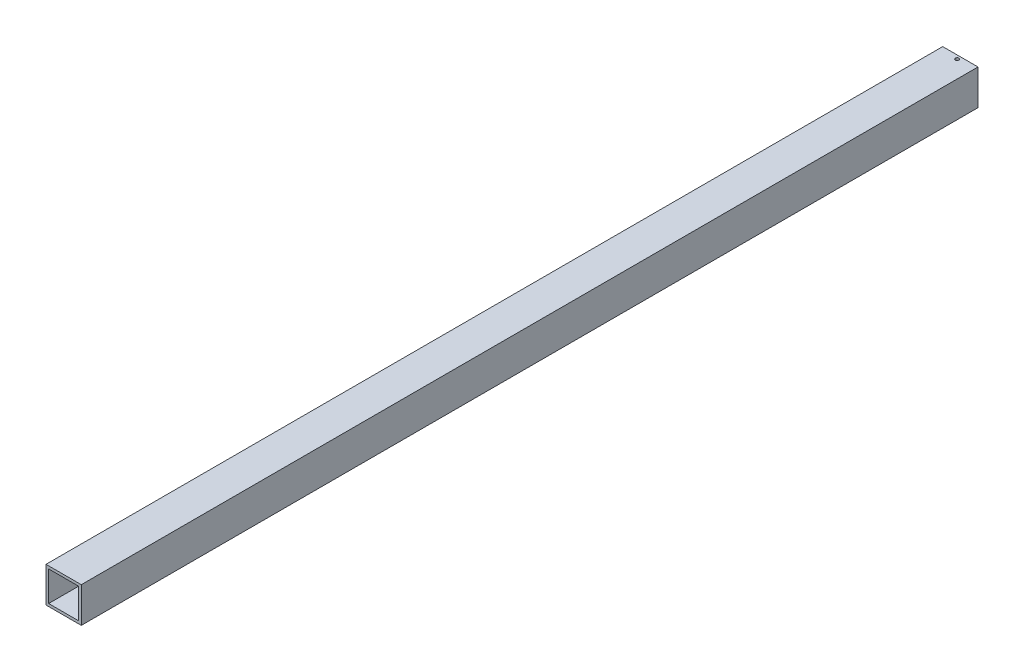
ISO-10303-21;
HEADER;
FILE_DESCRIPTION(('STEP AP214'),'2;1');
FILE_NAME('part.step','',(''),(''),'','','');
FILE_SCHEMA(('AUTOMOTIVE_DESIGN { 1 0 10303 214 1 1 1 1 }'));
ENDSEC;
DATA;
#1=APPLICATION_CONTEXT('core data for automotive mechanical design processes');
#2=APPLICATION_PROTOCOL_DEFINITION('international standard','automotive_design',2000,#1);
#3=PRODUCT_CONTEXT('',#1,'mechanical');
#4=PRODUCT('Part','Part','',(#3));
#5=PRODUCT_RELATED_PRODUCT_CATEGORY('part','',(#4));
#6=PRODUCT_DEFINITION_FORMATION('','',#4);
#7=PRODUCT_DEFINITION_CONTEXT('part definition',#1,'design');
#8=PRODUCT_DEFINITION('design','',#6,#7);
#9=PRODUCT_DEFINITION_SHAPE('','',#8);
#10=(LENGTH_UNIT() NAMED_UNIT(*) SI_UNIT(.MILLI.,.METRE.));
#11=(NAMED_UNIT(*) PLANE_ANGLE_UNIT() SI_UNIT($,.RADIAN.));
#12=(NAMED_UNIT(*) SI_UNIT($,.STERADIAN.) SOLID_ANGLE_UNIT());
#13=UNCERTAINTY_MEASURE_WITH_UNIT(LENGTH_MEASURE(1.E-05),#10,'distance_accuracy_value','');
#14=(GEOMETRIC_REPRESENTATION_CONTEXT(3) GLOBAL_UNCERTAINTY_ASSIGNED_CONTEXT((#13)) GLOBAL_UNIT_ASSIGNED_CONTEXT((#10,
#11,#12)) REPRESENTATION_CONTEXT('',''));
#15=CARTESIAN_POINT('',(0.,0.,0.));
#16=DIRECTION('',(0.,0.,1.));
#17=DIRECTION('',(1.,0.,0.));
#18=AXIS2_PLACEMENT_3D('',#15,#16,#17);
#19=CARTESIAN_POINT('',(-10.422988866238,18.5,536.599637723644));
#20=DIRECTION('',(-1.,0.,0.));
#21=DIRECTION('',(0.,-1.,0.));
#22=AXIS2_PLACEMENT_3D('',#19,#20,#21);
#23=PLANE('',#22);
#24=DIRECTION('',(0.,1.,0.));
#25=VECTOR('',#24,1.);
#26=CARTESIAN_POINT('',(-10.422988866238,18.5,508.315366476183));
#27=LINE('',#26,#25);
#28=CARTESIAN_POINT('',(-10.422988866238,-1.5,508.315366476183));
#29=VERTEX_POINT('',#28);
#30=CARTESIAN_POINT('',(-10.4229888662381,18.5000000000006,508.315366476183));
#31=VERTEX_POINT('',#30);
#32=EDGE_CURVE('E11',#29,#31,#27,.T.);
#33=ORIENTED_EDGE('',*,*,#32,.F.);
#34=DIRECTION('',(0.,0.,-1.));
#35=VECTOR('',#34,1.);
#36=CARTESIAN_POINT('',(-10.422988866238,-1.5,536.599637723644));
#37=LINE('',#36,#35);
#38=CARTESIAN_POINT('',(-10.422988866238,-1.5,0.));
#39=VERTEX_POINT('',#38);
#40=EDGE_CURVE('E151',#29,#39,#37,.T.);
#41=ORIENTED_EDGE('',*,*,#40,.T.);
#42=DIRECTION('',(0.,1.,0.));
#43=VECTOR('',#42,1.);
#44=CARTESIAN_POINT('',(-10.422988866238,18.5,0.));
#45=LINE('',#44,#43);
#46=CARTESIAN_POINT('',(-10.422988866238,18.5,0.));
#47=VERTEX_POINT('',#46);
#48=EDGE_CURVE('E146',#39,#47,#45,.T.);
#49=ORIENTED_EDGE('',*,*,#48,.T.);
#50=DIRECTION('',(0.,0.,-1.));
#51=VECTOR('',#50,1.);
#52=CARTESIAN_POINT('',(-10.422988866238,18.5,536.599637723644));
#53=LINE('',#52,#51);
#54=EDGE_CURVE('E149',#31,#47,#53,.T.);
#55=ORIENTED_EDGE('',*,*,#54,.F.);
#56=EDGE_LOOP('',(#33,#41,#49,#55));
#57=FACE_BOUND('',#56,.T.);
#58=ADVANCED_FACE('F32',(#57),#23,.F.);
#59=CARTESIAN_POINT('',(-30.422988866238,-1.5,536.599637723644));
#60=DIRECTION('',(0.,1.,0.));
#61=DIRECTION('',(0.,0.,1.));
#62=AXIS2_PLACEMENT_3D('',#59,#60,#61);
#63=PLANE('',#62);
#64=CARTESIAN_POINT('',(-20.1716169837596,-1.5,2.04638998269502));
#65=DIRECTION('',(0.,1.,0.));
#66=DIRECTION('',(-1.,0.,0.));
#67=AXIS2_PLACEMENT_3D('',#64,#65,#66);
#68=CIRCLE('',#67,1.);
#69=CARTESIAN_POINT('',(-21.1716169837596,-1.50000000000001,2.04638998269502));
#70=VERTEX_POINT('',#69);
#71=EDGE_CURVE('E170',#70,#70,#68,.T.);
#72=ORIENTED_EDGE('',*,*,#71,.T.);
#73=EDGE_LOOP('',(#72));
#74=FACE_BOUND('',#73,.T.);
#75=DIRECTION('',(1.,0.,0.));
#76=VECTOR('',#75,1.);
#77=CARTESIAN_POINT('',(-30.4229888662381,-1.5,508.315366476183));
#78=LINE('',#77,#76);
#79=CARTESIAN_POINT('',(-30.4229888662381,-1.49999999999943,508.315366476183));
#80=VERTEX_POINT('',#79);
#81=EDGE_CURVE('E71',#80,#29,#78,.T.);
#82=ORIENTED_EDGE('',*,*,#81,.F.);
#83=DIRECTION('',(0.,0.,-1.));
#84=VECTOR('',#83,1.);
#85=CARTESIAN_POINT('',(-30.422988866238,-1.5,536.599637723644));
#86=LINE('',#85,#84);
#87=CARTESIAN_POINT('',(-30.422988866238,-1.5,0.));
#88=VERTEX_POINT('',#87);
#89=EDGE_CURVE('E153',#80,#88,#86,.T.);
#90=ORIENTED_EDGE('',*,*,#89,.T.);
#91=DIRECTION('',(1.,0.,0.));
#92=VECTOR('',#91,1.);
#93=CARTESIAN_POINT('',(-30.422988866238,-1.5,0.));
#94=LINE('',#93,#92);
#95=EDGE_CURVE('E143',#88,#39,#94,.T.);
#96=ORIENTED_EDGE('',*,*,#95,.T.);
#97=ORIENTED_EDGE('',*,*,#40,.F.);
#98=EDGE_LOOP('',(#82,#90,#96,#97));
#99=FACE_BOUND('',#98,.T.);
#100=ADVANCED_FACE('F193',(#74,#99),#63,.F.);
#101=CARTESIAN_POINT('',(-30.422988866238,18.5,536.599637723644));
#102=DIRECTION('',(1.,0.,0.));
#103=DIRECTION('',(0.,1.,0.));
#104=AXIS2_PLACEMENT_3D('',#101,#102,#103);
#105=PLANE('',#104);
#106=DIRECTION('',(0.,-1.,0.));
#107=VECTOR('',#106,1.);
#108=CARTESIAN_POINT('',(-30.422988866238,18.5,508.315366476183));
#109=LINE('',#108,#107);
#110=CARTESIAN_POINT('',(-30.4229888662381,18.5000000000006,508.315366476183));
#111=VERTEX_POINT('',#110);
#112=EDGE_CURVE('E161',#111,#80,#109,.T.);
#113=ORIENTED_EDGE('',*,*,#112,.F.);
#114=DIRECTION('',(0.,0.,-1.));
#115=VECTOR('',#114,1.);
#116=CARTESIAN_POINT('',(-30.422988866238,18.5,536.599637723644));
#117=LINE('',#116,#115);
#118=CARTESIAN_POINT('',(-30.422988866238,18.5,0.));
#119=VERTEX_POINT('',#118);
#120=EDGE_CURVE('E155',#111,#119,#117,.T.);
#121=ORIENTED_EDGE('',*,*,#120,.T.);
#122=DIRECTION('',(0.,-1.,0.));
#123=VECTOR('',#122,1.);
#124=CARTESIAN_POINT('',(-30.422988866238,18.5,0.));
#125=LINE('',#124,#123);
#126=EDGE_CURVE('E140',#119,#88,#125,.T.);
#127=ORIENTED_EDGE('',*,*,#126,.T.);
#128=ORIENTED_EDGE('',*,*,#89,.F.);
#129=EDGE_LOOP('',(#113,#121,#127,#128));
#130=FACE_BOUND('',#129,.T.);
#131=ADVANCED_FACE('F199',(#130),#105,.F.);
#132=CARTESIAN_POINT('',(-30.422988866238,18.5,536.599637723644));
#133=DIRECTION('',(0.,-1.,0.));
#134=DIRECTION('',(1.,0.,0.));
#135=AXIS2_PLACEMENT_3D('',#132,#133,#134);
#136=PLANE('',#135);
#137=CARTESIAN_POINT('',(-20.1716169837596,18.5,2.04638998269502));
#138=DIRECTION('',(0.,1.,0.));
#139=DIRECTION('',(-1.,0.,0.));
#140=AXIS2_PLACEMENT_3D('',#137,#138,#139);
#141=CIRCLE('',#140,1.);
#142=CARTESIAN_POINT('',(-21.1716169837596,18.5,2.04638998269502));
#143=VERTEX_POINT('',#142);
#144=EDGE_CURVE('E167',#143,#143,#141,.T.);
#145=ORIENTED_EDGE('',*,*,#144,.F.);
#146=EDGE_LOOP('',(#145));
#147=FACE_BOUND('',#146,.T.);
#148=DIRECTION('',(-1.,0.,0.));
#149=VECTOR('',#148,1.);
#150=CARTESIAN_POINT('',(-30.4229888662381,18.5,508.315366476183));
#151=LINE('',#150,#149);
#152=EDGE_CURVE('E162',#31,#111,#151,.T.);
#153=ORIENTED_EDGE('',*,*,#152,.F.);
#154=ORIENTED_EDGE('',*,*,#54,.T.);
#155=DIRECTION('',(-1.,0.,0.));
#156=VECTOR('',#155,1.);
#157=CARTESIAN_POINT('',(-30.422988866238,18.5,0.));
#158=LINE('',#157,#156);
#159=EDGE_CURVE('E109',#47,#119,#158,.T.);
#160=ORIENTED_EDGE('',*,*,#159,.T.);
#161=ORIENTED_EDGE('',*,*,#120,.F.);
#162=EDGE_LOOP('',(#153,#154,#160,#161));
#163=FACE_BOUND('',#162,.T.);
#164=ADVANCED_FACE('F34',(#147,#163),#136,.F.);
#165=CARTESIAN_POINT('',(0.,0.,0.));
#166=DIRECTION('',(0.,0.,-1.));
#167=DIRECTION('',(-1.,0.,0.));
#168=AXIS2_PLACEMENT_3D('',#165,#166,#167);
#169=PLANE('',#168);
#170=ORIENTED_EDGE('',*,*,#159,.F.);
#171=ORIENTED_EDGE('',*,*,#48,.F.);
#172=ORIENTED_EDGE('',*,*,#95,.F.);
#173=ORIENTED_EDGE('',*,*,#126,.F.);
#174=EDGE_LOOP('',(#170,#171,#172,#173));
#175=FACE_BOUND('',#174,.T.);
#176=DIRECTION('',(-1.,0.,0.));
#177=VECTOR('',#176,1.);
#178=CARTESIAN_POINT('',(-28.922988866238,17.,0.));
#179=LINE('',#178,#177);
#180=CARTESIAN_POINT('',(-11.922988866238,17.,0.));
#181=VERTEX_POINT('',#180);
#182=CARTESIAN_POINT('',(-28.922988866238,17.,0.));
#183=VERTEX_POINT('',#182);
#184=EDGE_CURVE('E123',#181,#183,#179,.T.);
#185=ORIENTED_EDGE('',*,*,#184,.T.);
#186=DIRECTION('',(0.,-1.,0.));
#187=VECTOR('',#186,1.);
#188=CARTESIAN_POINT('',(-28.922988866238,17.,0.));
#189=LINE('',#188,#187);
#190=CARTESIAN_POINT('',(-28.922988866238,0.,0.));
#191=VERTEX_POINT('',#190);
#192=EDGE_CURVE('E106',#183,#191,#189,.T.);
#193=ORIENTED_EDGE('',*,*,#192,.T.);
#194=DIRECTION('',(1.,0.,0.));
#195=VECTOR('',#194,1.);
#196=CARTESIAN_POINT('',(-28.922988866238,0.,0.));
#197=LINE('',#196,#195);
#198=CARTESIAN_POINT('',(-11.922988866238,0.,0.));
#199=VERTEX_POINT('',#198);
#200=EDGE_CURVE('E113',#191,#199,#197,.T.);
#201=ORIENTED_EDGE('',*,*,#200,.T.);
#202=DIRECTION('',(0.,1.,0.));
#203=VECTOR('',#202,1.);
#204=CARTESIAN_POINT('',(-11.922988866238,17.,0.));
#205=LINE('',#204,#203);
#206=EDGE_CURVE('E119',#199,#181,#205,.T.);
#207=ORIENTED_EDGE('',*,*,#206,.T.);
#208=EDGE_LOOP('',(#185,#193,#201,#207));
#209=FACE_BOUND('',#208,.T.);
#210=ADVANCED_FACE('F121',(#175,#209),#169,.T.);
#211=CARTESIAN_POINT('',(-28.922988866238,17.,536.599637723644));
#212=DIRECTION('',(0.,-1.,0.));
#213=DIRECTION('',(0.,0.,-1.));
#214=AXIS2_PLACEMENT_3D('',#211,#212,#213);
#215=PLANE('',#214);
#216=CARTESIAN_POINT('',(-20.1716169837596,17.,2.04638998269502));
#217=DIRECTION('',(0.,-1.,0.));
#218=DIRECTION('',(0.,0.,-1.));
#219=AXIS2_PLACEMENT_3D('',#216,#217,#218);
#220=CIRCLE('',#219,1.);
#221=CARTESIAN_POINT('',(-20.1716169837596,17.,1.04638998269502));
#222=VERTEX_POINT('',#221);
#223=EDGE_CURVE('E124',#222,#222,#220,.T.);
#224=ORIENTED_EDGE('',*,*,#223,.F.);
#225=EDGE_LOOP('',(#224));
#226=FACE_BOUND('',#225,.T.);
#227=DIRECTION('',(0.,0.,-1.));
#228=VECTOR('',#227,1.);
#229=CARTESIAN_POINT('',(-11.922988866238,17.,536.599637723644));
#230=LINE('',#229,#228);
#231=CARTESIAN_POINT('',(-11.922988866238,17.,508.315366476183));
#232=VERTEX_POINT('',#231);
#233=EDGE_CURVE('E135',#232,#181,#230,.T.);
#234=ORIENTED_EDGE('',*,*,#233,.F.);
#235=DIRECTION('',(-1.,0.,0.));
#236=VECTOR('',#235,1.);
#237=CARTESIAN_POINT('',(-28.9229888662381,17.,508.315366476183));
#238=LINE('',#237,#236);
#239=CARTESIAN_POINT('',(-28.922988866238,17.,508.315366476183));
#240=VERTEX_POINT('',#239);
#241=EDGE_CURVE('E157',#232,#240,#238,.T.);
#242=ORIENTED_EDGE('',*,*,#241,.T.);
#243=DIRECTION('',(0.,0.,-1.));
#244=VECTOR('',#243,1.);
#245=CARTESIAN_POINT('',(-28.922988866238,17.,536.599637723644));
#246=LINE('',#245,#244);
#247=EDGE_CURVE('E133',#240,#183,#246,.T.);
#248=ORIENTED_EDGE('',*,*,#247,.T.);
#249=ORIENTED_EDGE('',*,*,#184,.F.);
#250=EDGE_LOOP('',(#234,#242,#248,#249));
#251=FACE_BOUND('',#250,.T.);
#252=ADVANCED_FACE('F189',(#226,#251),#215,.T.);
#253=CARTESIAN_POINT('',(-11.922988866238,17.,536.599637723644));
#254=DIRECTION('',(-1.,0.,0.));
#255=DIRECTION('',(0.,-1.,0.));
#256=AXIS2_PLACEMENT_3D('',#253,#254,#255);
#257=PLANE('',#256);
#258=DIRECTION('',(0.,0.,-1.));
#259=VECTOR('',#258,1.);
#260=CARTESIAN_POINT('',(-11.922988866238,0.,536.599637723644));
#261=LINE('',#260,#259);
#262=CARTESIAN_POINT('',(-11.922988866238,0.,508.315366476183));
#263=VERTEX_POINT('',#262);
#264=EDGE_CURVE('E110',#263,#199,#261,.T.);
#265=ORIENTED_EDGE('',*,*,#264,.F.);
#266=DIRECTION('',(0.,1.,0.));
#267=VECTOR('',#266,1.);
#268=CARTESIAN_POINT('',(-11.922988866238,17.,508.315366476183));
#269=LINE('',#268,#267);
#270=EDGE_CURVE('E42',#263,#232,#269,.T.);
#271=ORIENTED_EDGE('',*,*,#270,.T.);
#272=ORIENTED_EDGE('',*,*,#233,.T.);
#273=ORIENTED_EDGE('',*,*,#206,.F.);
#274=EDGE_LOOP('',(#265,#271,#272,#273));
#275=FACE_BOUND('',#274,.T.);
#276=ADVANCED_FACE('F181',(#275),#257,.T.);
#277=CARTESIAN_POINT('',(-28.922988866238,0.,536.599637723644));
#278=DIRECTION('',(0.,1.,0.));
#279=DIRECTION('',(0.,0.,1.));
#280=AXIS2_PLACEMENT_3D('',#277,#278,#279);
#281=PLANE('',#280);
#282=CARTESIAN_POINT('',(-20.1716169837596,0.,2.04638998269502));
#283=DIRECTION('',(0.,1.,0.));
#284=DIRECTION('',(0.,0.,1.));
#285=AXIS2_PLACEMENT_3D('',#282,#283,#284);
#286=CIRCLE('',#285,1.);
#287=CARTESIAN_POINT('',(-20.1716169837596,0.,3.04638998269502));
#288=VERTEX_POINT('',#287);
#289=EDGE_CURVE('E36',#288,#288,#286,.T.);
#290=ORIENTED_EDGE('',*,*,#289,.F.);
#291=EDGE_LOOP('',(#290));
#292=FACE_BOUND('',#291,.T.);
#293=DIRECTION('',(0.,0.,-1.));
#294=VECTOR('',#293,1.);
#295=CARTESIAN_POINT('',(-28.922988866238,0.,536.599637723644));
#296=LINE('',#295,#294);
#297=CARTESIAN_POINT('',(-28.922988866238,0.,508.315366476183));
#298=VERTEX_POINT('',#297);
#299=EDGE_CURVE('E102',#298,#191,#296,.T.);
#300=ORIENTED_EDGE('',*,*,#299,.F.);
#301=DIRECTION('',(1.,0.,0.));
#302=VECTOR('',#301,1.);
#303=CARTESIAN_POINT('',(-28.9229888662381,0.,508.315366476183));
#304=LINE('',#303,#302);
#305=EDGE_CURVE('E51',#298,#263,#304,.T.);
#306=ORIENTED_EDGE('',*,*,#305,.T.);
#307=ORIENTED_EDGE('',*,*,#264,.T.);
#308=ORIENTED_EDGE('',*,*,#200,.F.);
#309=EDGE_LOOP('',(#300,#306,#307,#308));
#310=FACE_BOUND('',#309,.T.);
#311=ADVANCED_FACE('F114',(#292,#310),#281,.T.);
#312=CARTESIAN_POINT('',(-28.922988866238,17.,536.599637723644));
#313=DIRECTION('',(1.,0.,0.));
#314=DIRECTION('',(0.,1.,0.));
#315=AXIS2_PLACEMENT_3D('',#312,#313,#314);
#316=PLANE('',#315);
#317=ORIENTED_EDGE('',*,*,#247,.F.);
#318=DIRECTION('',(0.,-1.,0.));
#319=VECTOR('',#318,1.);
#320=CARTESIAN_POINT('',(-28.922988866238,17.,508.315366476183));
#321=LINE('',#320,#319);
#322=EDGE_CURVE('E75',#240,#298,#321,.T.);
#323=ORIENTED_EDGE('',*,*,#322,.T.);
#324=ORIENTED_EDGE('',*,*,#299,.T.);
#325=ORIENTED_EDGE('',*,*,#192,.F.);
#326=EDGE_LOOP('',(#317,#323,#324,#325));
#327=FACE_BOUND('',#326,.T.);
#328=ADVANCED_FACE('F104',(#327),#316,.T.);
#329=CARTESIAN_POINT('',(-10.4229888662381,18.5000000000006,508.315366476183));
#330=DIRECTION('',(0.,0.,1.));
#331=DIRECTION('',(-1.,0.,0.));
#332=AXIS2_PLACEMENT_3D('',#329,#330,#331);
#333=PLANE('',#332);
#334=ORIENTED_EDGE('',*,*,#241,.F.);
#335=ORIENTED_EDGE('',*,*,#270,.F.);
#336=ORIENTED_EDGE('',*,*,#305,.F.);
#337=ORIENTED_EDGE('',*,*,#322,.F.);
#338=EDGE_LOOP('',(#334,#335,#336,#337));
#339=FACE_BOUND('',#338,.T.);
#340=ORIENTED_EDGE('',*,*,#112,.T.);
#341=ORIENTED_EDGE('',*,*,#81,.T.);
#342=ORIENTED_EDGE('',*,*,#32,.T.);
#343=ORIENTED_EDGE('',*,*,#152,.T.);
#344=EDGE_LOOP('',(#340,#341,#342,#343));
#345=FACE_BOUND('',#344,.T.);
#346=ADVANCED_FACE('F187',(#339,#345),#333,.T.);
#347=CARTESIAN_POINT('',(-20.1716169837596,-1.5,2.04638998269502));
#348=DIRECTION('',(0.,1.,0.));
#349=DIRECTION('',(-1.,0.,0.));
#350=AXIS2_PLACEMENT_3D('',#347,#348,#349);
#351=CYLINDRICAL_SURFACE('',#350,1.);
#352=ORIENTED_EDGE('',*,*,#289,.T.);
#353=EDGE_LOOP('',(#352));
#354=FACE_BOUND('',#353,.T.);
#355=ORIENTED_EDGE('',*,*,#71,.F.);
#356=EDGE_LOOP('',(#355));
#357=FACE_BOUND('',#356,.T.);
#358=ADVANCED_FACE('F177',(#354,#357),#351,.F.);
#359=ORIENTED_EDGE('',*,*,#223,.T.);
#360=EDGE_LOOP('',(#359));
#361=FACE_BOUND('',#360,.T.);
#362=ORIENTED_EDGE('',*,*,#144,.T.);
#363=EDGE_LOOP('',(#362));
#364=FACE_BOUND('',#363,.T.);
#365=ADVANCED_FACE('F232',(#361,#364),#351,.F.);
#366=CLOSED_SHELL('',(#58,#100,#131,#164,#210,#252,#276,#311,#328,#346,#358,#365));
#367=MANIFOLD_SOLID_BREP('B2',#366);
#368=ADVANCED_BREP_SHAPE_REPRESENTATION('',(#18,#367),#14);
#369=SHAPE_DEFINITION_REPRESENTATION(#9,#368);
ENDSEC;
END-ISO-10303-21;
